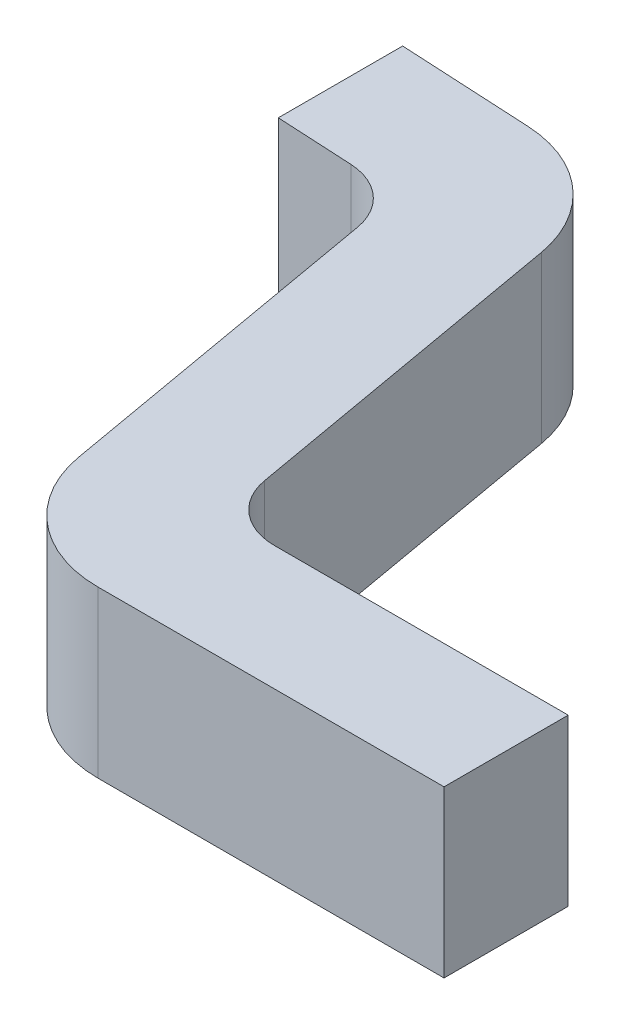
ISO-10303-21;
HEADER;
FILE_DESCRIPTION(('STEP AP214'),'2;1');
FILE_NAME('part.step','',(''),(''),'','','');
FILE_SCHEMA(('AUTOMOTIVE_DESIGN { 1 0 10303 214 1 1 1 1 }'));
ENDSEC;
DATA;
#1=APPLICATION_CONTEXT('core data for automotive mechanical design processes');
#2=APPLICATION_PROTOCOL_DEFINITION('international standard','automotive_design',2000,#1);
#3=PRODUCT_CONTEXT('',#1,'mechanical');
#4=PRODUCT('Part','Part','',(#3));
#5=PRODUCT_RELATED_PRODUCT_CATEGORY('part','',(#4));
#6=PRODUCT_DEFINITION_FORMATION('','',#4);
#7=PRODUCT_DEFINITION_CONTEXT('part definition',#1,'design');
#8=PRODUCT_DEFINITION('design','',#6,#7);
#9=PRODUCT_DEFINITION_SHAPE('','',#8);
#10=(LENGTH_UNIT() NAMED_UNIT(*) SI_UNIT(.MILLI.,.METRE.));
#11=(NAMED_UNIT(*) PLANE_ANGLE_UNIT() SI_UNIT($,.RADIAN.));
#12=(NAMED_UNIT(*) SI_UNIT($,.STERADIAN.) SOLID_ANGLE_UNIT());
#13=UNCERTAINTY_MEASURE_WITH_UNIT(LENGTH_MEASURE(1.E-05),#10,'distance_accuracy_value','');
#14=(GEOMETRIC_REPRESENTATION_CONTEXT(3) GLOBAL_UNCERTAINTY_ASSIGNED_CONTEXT((#13)) GLOBAL_UNIT_ASSIGNED_CONTEXT((#10,
#11,#12)) REPRESENTATION_CONTEXT('',''));
#15=CARTESIAN_POINT('',(0.,0.,0.));
#16=DIRECTION('',(0.,0.,1.));
#17=DIRECTION('',(1.,0.,0.));
#18=AXIS2_PLACEMENT_3D('',#15,#16,#17);
#19=CARTESIAN_POINT('',(35.054447896144,23.925497867435,0.43342975681));
#20=DIRECTION('',(8.74227743530297E-08,-0.999999999999996,0.));
#21=DIRECTION('',(0.999999999999996,8.74227743530297E-08,0.));
#22=AXIS2_PLACEMENT_3D('',#19,#20,#21);
#23=PLANE('',#22);
#24=DIRECTION('',(0.,0.,1.));
#25=VECTOR('',#24,1.);
#26=CARTESIAN_POINT('',(34.699999848699,23.925497836448,0.1502058519));
#27=LINE('',#26,#25);
#28=CARTESIAN_POINT('',(34.699999848699,23.9254978391413,0.150205851899956));
#29=VERTEX_POINT('',#28);
#30=CARTESIAN_POINT('',(34.6999998370743,23.925497836448,-6.092267662786E-10));
#31=VERTEX_POINT('',#30);
#32=EDGE_CURVE('E159',#29,#31,#27,.F.);
#33=ORIENTED_EDGE('',*,*,#32,.T.);
#34=DIRECTION('',(0.998629534754575,0.,0.0523359562429177));
#35=VECTOR('',#34,1.);
#36=CARTESIAN_POINT('',(34.699999848699,23.925497836448,0.));
#37=LINE('',#36,#35);
#38=CARTESIAN_POINT('',(34.8598479787902,23.9254978434356,0.00837728552066805));
#39=VERTEX_POINT('',#38);
#40=EDGE_CURVE('E151',#31,#39,#37,.T.);
#41=ORIENTED_EDGE('',*,*,#40,.T.);
#42=CARTESIAN_POINT('',(34.851997585354,23.9254978497368,0.158171715734));
#43=DIRECTION('',(8.74227743530297E-08,-0.999999999999996,0.));
#44=DIRECTION('',(0.999999999999996,8.74227743530297E-08,0.));
#45=AXIS2_PLACEMENT_3D('',#42,#43,#44);
#46=CIRCLE('',#45,0.15);
#47=CARTESIAN_POINT('',(34.9997187480424,23.925497862651,0.132124487588905));
#48=VERTEX_POINT('',#47);
#49=EDGE_CURVE('E195',#48,#39,#46,.F.);
#50=ORIENTED_EDGE('',*,*,#49,.F.);
#51=DIRECTION('',(0.173648177667034,0.,0.98480775301219));
#52=VECTOR('',#51,1.);
#53=CARTESIAN_POINT('',(34.978999848699,23.925497862651,0.01462177041997));
#54=LINE('',#53,#52);
#55=CARTESIAN_POINT('',(35.0712897153554,23.925497865779,0.538023613324977));
#56=VERTEX_POINT('',#55);
#57=EDGE_CURVE('E90',#48,#56,#54,.T.);
#58=ORIENTED_EDGE('',*,*,#57,.T.);
#59=CARTESIAN_POINT('',(35.145150296831,23.9254978753641,0.525));
#60=DIRECTION('',(8.74227743530297E-08,-0.999999999999996,0.));
#61=DIRECTION('',(0.999999999999996,8.74227743530297E-08,0.));
#62=AXIS2_PLACEMENT_3D('',#59,#60,#61);
#63=CIRCLE('',#62,0.075);
#64=CARTESIAN_POINT('',(35.145150279347,23.9254978753645,0.599999999999999));
#65=VERTEX_POINT('',#64);
#66=EDGE_CURVE('E20',#56,#65,#63,.F.);
#67=ORIENTED_EDGE('',*,*,#66,.T.);
#68=DIRECTION('',(1.,0.,0.));
#69=VECTOR('',#68,1.);
#70=CARTESIAN_POINT('',(35.082217824493,23.925497875365,0.6));
#71=LINE('',#70,#69);
#72=CARTESIAN_POINT('',(35.499999848699,23.9254978960457,0.6));
#73=VERTEX_POINT('',#72);
#74=EDGE_CURVE('E96',#65,#73,#71,.T.);
#75=ORIENTED_EDGE('',*,*,#74,.T.);
#76=DIRECTION('',(0.,0.,1.));
#77=VECTOR('',#76,1.);
#78=CARTESIAN_POINT('',(35.499999848699,23.925497906386,0.6));
#79=LINE('',#78,#77);
#80=CARTESIAN_POINT('',(35.4999998370423,23.925497906386,0.75));
#81=VERTEX_POINT('',#80);
#82=EDGE_CURVE('E101',#73,#81,#79,.T.);
#83=ORIENTED_EDGE('',*,*,#82,.T.);
#84=DIRECTION('',(-1.,0.,0.));
#85=VECTOR('',#84,1.);
#86=CARTESIAN_POINT('',(35.499999848699,23.925497906386,0.75));
#87=LINE('',#86,#85);
#88=CARTESIAN_POINT('',(35.082217824493,23.9254978881246,0.75));
#89=VERTEX_POINT('',#88);
#90=EDGE_CURVE('E119',#81,#89,#87,.T.);
#91=ORIENTED_EDGE('',*,*,#90,.T.);
#92=CARTESIAN_POINT('',(35.082217824493,23.9254978698632,0.6));
#93=DIRECTION('',(8.74227743530297E-08,-0.999999999999996,0.));
#94=DIRECTION('',(0.999999999999996,8.74227743530297E-08,0.));
#95=AXIS2_PLACEMENT_3D('',#92,#93,#94);
#96=CIRCLE('',#95,0.15);
#97=CARTESIAN_POINT('',(34.9344966612771,23.925497856949,0.62604722515503));
#98=VERTEX_POINT('',#97);
#99=EDGE_CURVE('E177',#98,#89,#96,.F.);
#100=ORIENTED_EDGE('',*,*,#99,.F.);
#101=DIRECTION('',(-0.173648177667034,0.,-0.98480775301219));
#102=VECTOR('',#101,1.);
#103=CARTESIAN_POINT('',(34.956352879816,23.925497856949,0.75));
#104=LINE('',#103,#102);
#105=CARTESIAN_POINT('',(34.862357035157,23.9254978537955,0.216923075066056));
#106=VERTEX_POINT('',#105);
#107=EDGE_CURVE('E172',#98,#106,#104,.T.);
#108=ORIENTED_EDGE('',*,*,#107,.T.);
#109=CARTESIAN_POINT('',(34.788496453681,23.9254978441849,0.229946688391));
#110=DIRECTION('',(8.74227743530297E-08,-0.999999999999996,0.));
#111=DIRECTION('',(0.999999999999996,8.74227743530297E-08,0.));
#112=AXIS2_PLACEMENT_3D('',#109,#110,#111);
#113=CIRCLE('',#112,0.075);
#114=CARTESIAN_POINT('',(34.7924216329629,23.925497844528,0.15504947237056));
#115=VERTEX_POINT('',#114);
#116=EDGE_CURVE('E169',#106,#115,#113,.F.);
#117=ORIENTED_EDGE('',*,*,#116,.T.);
#118=DIRECTION('',(-0.998629534754575,0.,-0.0523359562429177));
#119=VECTOR('',#118,1.);
#120=CARTESIAN_POINT('',(34.851997585354,23.925497844528,0.158171715734));
#121=LINE('',#120,#119);
#122=EDGE_CURVE('E165',#115,#29,#121,.T.);
#123=ORIENTED_EDGE('',*,*,#122,.T.);
#124=EDGE_LOOP('',(#33,#41,#50,#58,#67,#75,#83,#91,#100,#108,#117,#123));
#125=FACE_BOUND('',#124,.T.);
#126=ADVANCED_FACE('F17',(#125),#23,.T.);
#127=CARTESIAN_POINT('',(34.978999848699,23.925497860839,0.01462177041997));
#128=DIRECTION('',(-0.984807753012186,-8.60946259727163E-08,0.173648177667033));
#129=DIRECTION('',(0.173648177667034,0.,0.98480775301219));
#130=AXIS2_PLACEMENT_3D('',#127,#128,#129);
#131=PLANE('',#130);
#132=ORIENTED_EDGE('',*,*,#57,.F.);
#133=DIRECTION('',(8.74227743530297E-08,-0.999999999999996,0.));
#134=VECTOR('',#133,1.);
#135=CARTESIAN_POINT('',(34.9997187483058,23.9254978626502,0.132124489083952));
#136=LINE('',#135,#134);
#137=CARTESIAN_POINT('',(34.9997187308211,24.1254978626507,0.132124489083926));
#138=VERTEX_POINT('',#137);
#139=EDGE_CURVE('E154',#138,#48,#136,.T.);
#140=ORIENTED_EDGE('',*,*,#139,.F.);
#141=DIRECTION('',(0.173648177667817,1.51808053790604E-08,0.984807753012052));
#142=VECTOR('',#141,1.);
#143=CARTESIAN_POINT('',(34.999718730821,24.1254978626504,0.132124489084));
#144=LINE('',#143,#142);
#145=CARTESIAN_POINT('',(35.0712896978709,24.1254978689076,0.538023613325023));
#146=VERTEX_POINT('',#145);
#147=EDGE_CURVE('E194',#138,#146,#144,.T.);
#148=ORIENTED_EDGE('',*,*,#147,.T.);
#149=DIRECTION('',(8.74227743530297E-08,-0.999999999999996,0.));
#150=VECTOR('',#149,1.);
#151=CARTESIAN_POINT('',(35.0712897153551,23.9254978689079,0.538023613325082));
#152=LINE('',#151,#150);
#153=EDGE_CURVE('E148',#146,#56,#152,.T.);
#154=ORIENTED_EDGE('',*,*,#153,.T.);
#155=EDGE_LOOP('',(#132,#140,#148,#154));
#156=FACE_BOUND('',#155,.T.);
#157=ADVANCED_FACE('F255',(#156),#131,.F.);
#158=CARTESIAN_POINT('',(35.145150296831,23.925497875365,0.525));
#159=DIRECTION('',(8.74227743530297E-08,-0.999999999999996,0.));
#160=DIRECTION('',(0.999999999999996,8.74227743530297E-08,0.));
#161=AXIS2_PLACEMENT_3D('',#158,#159,#160);
#162=CYLINDRICAL_SURFACE('',#161,0.075);
#163=ORIENTED_EDGE('',*,*,#153,.F.);
#164=CARTESIAN_POINT('',(35.1451502793464,24.125497875365,0.525));
#165=DIRECTION('',(8.74227743530297E-08,-0.999999999999996,0.));
#166=DIRECTION('',(0.999999999999996,8.74227743530297E-08,0.));
#167=AXIS2_PLACEMENT_3D('',#164,#165,#166);
#168=CIRCLE('',#167,0.075);
#169=CARTESIAN_POINT('',(35.1451502793467,24.1254978753647,0.6));
#170=VERTEX_POINT('',#169);
#171=EDGE_CURVE('E135',#146,#170,#168,.F.);
#172=ORIENTED_EDGE('',*,*,#171,.T.);
#173=DIRECTION('',(0.,1.,0.));
#174=VECTOR('',#173,1.);
#175=CARTESIAN_POINT('',(35.145150279347,23.925497869863,0.6));
#176=LINE('',#175,#174);
#177=EDGE_CURVE('E143',#170,#65,#176,.F.);
#178=ORIENTED_EDGE('',*,*,#177,.T.);
#179=ORIENTED_EDGE('',*,*,#66,.F.);
#180=EDGE_LOOP('',(#163,#172,#178,#179));
#181=FACE_BOUND('',#180,.T.);
#182=ADVANCED_FACE('F258',(#181),#162,.F.);
#183=CARTESIAN_POINT('',(35.082217824493,23.925497869863,0.6));
#184=DIRECTION('',(0.,0.,1.));
#185=DIRECTION('',(1.,0.,0.));
#186=AXIS2_PLACEMENT_3D('',#183,#184,#185);
#187=PLANE('',#186);
#188=DIRECTION('',(0.999999999999996,8.74227743530297E-08,0.));
#189=VECTOR('',#188,1.);
#190=CARTESIAN_POINT('',(35.05444787866,24.125497867435,0.6));
#191=LINE('',#190,#189);
#192=CARTESIAN_POINT('',(35.4999998312141,24.1254979063864,0.6));
#193=VERTEX_POINT('',#192);
#194=EDGE_CURVE('E133',#170,#193,#191,.T.);
#195=ORIENTED_EDGE('',*,*,#194,.T.);
#196=DIRECTION('',(8.74227743530297E-08,-0.999999999999996,0.));
#197=VECTOR('',#196,1.);
#198=CARTESIAN_POINT('',(35.499999848699,23.925497906386,0.6));
#199=LINE('',#198,#197);
#200=EDGE_CURVE('E108',#193,#73,#199,.T.);
#201=ORIENTED_EDGE('',*,*,#200,.T.);
#202=ORIENTED_EDGE('',*,*,#74,.F.);
#203=ORIENTED_EDGE('',*,*,#177,.F.);
#204=EDGE_LOOP('',(#195,#201,#202,#203));
#205=FACE_BOUND('',#204,.T.);
#206=ADVANCED_FACE('F259',(#205),#187,.F.);
#207=CARTESIAN_POINT('',(35.499999848699,23.925497906386,0.6));
#208=DIRECTION('',(-0.999999999999996,-8.74227743530297E-08,0.));
#209=DIRECTION('',(8.74227743530297E-08,-0.999999999999996,0.));
#210=AXIS2_PLACEMENT_3D('',#207,#208,#209);
#211=PLANE('',#210);
#212=ORIENTED_EDGE('',*,*,#200,.F.);
#213=DIRECTION('',(0.,0.,1.));
#214=VECTOR('',#213,1.);
#215=CARTESIAN_POINT('',(35.499999831214,24.1254979063864,0.43342975681));
#216=LINE('',#215,#214);
#217=CARTESIAN_POINT('',(35.499999831214,24.1254979063864,0.75));
#218=VERTEX_POINT('',#217);
#219=EDGE_CURVE('E126',#193,#218,#216,.T.);
#220=ORIENTED_EDGE('',*,*,#219,.T.);
#221=DIRECTION('',(0.,1.,0.));
#222=VECTOR('',#221,1.);
#223=CARTESIAN_POINT('',(35.499999831214,23.925497906386,0.75));
#224=LINE('',#223,#222);
#225=EDGE_CURVE('E114',#218,#81,#224,.F.);
#226=ORIENTED_EDGE('',*,*,#225,.T.);
#227=ORIENTED_EDGE('',*,*,#82,.F.);
#228=EDGE_LOOP('',(#212,#220,#226,#227));
#229=FACE_BOUND('',#228,.T.);
#230=ADVANCED_FACE('F132',(#229),#211,.F.);
#231=CARTESIAN_POINT('',(35.499999848699,23.925497906386,0.75));
#232=DIRECTION('',(0.,0.,-1.));
#233=DIRECTION('',(-1.,0.,0.));
#234=AXIS2_PLACEMENT_3D('',#231,#232,#233);
#235=PLANE('',#234);
#236=ORIENTED_EDGE('',*,*,#90,.F.);
#237=ORIENTED_EDGE('',*,*,#225,.F.);
#238=DIRECTION('',(0.999999999999996,8.74227743530297E-08,0.));
#239=VECTOR('',#238,1.);
#240=CARTESIAN_POINT('',(35.05444787866,24.125497867435,0.75));
#241=LINE('',#240,#239);
#242=CARTESIAN_POINT('',(35.0822178070084,24.1254978698629,0.75));
#243=VERTEX_POINT('',#242);
#244=EDGE_CURVE('E118',#218,#243,#241,.F.);
#245=ORIENTED_EDGE('',*,*,#244,.T.);
#246=DIRECTION('',(8.74227743530297E-08,-0.999999999999996,0.));
#247=VECTOR('',#246,1.);
#248=CARTESIAN_POINT('',(35.082217824493,23.925497869863,0.75));
#249=LINE('',#248,#247);
#250=EDGE_CURVE('E198',#89,#243,#249,.F.);
#251=ORIENTED_EDGE('',*,*,#250,.F.);
#252=EDGE_LOOP('',(#236,#237,#245,#251));
#253=FACE_BOUND('',#252,.T.);
#254=ADVANCED_FACE('F116',(#253),#235,.F.);
#255=CARTESIAN_POINT('',(35.082217824493,23.925497869863,0.6));
#256=DIRECTION('',(8.74227743530297E-08,-0.999999999999996,0.));
#257=DIRECTION('',(0.999999999999996,8.74227743530297E-08,0.));
#258=AXIS2_PLACEMENT_3D('',#255,#256,#257);
#259=CYLINDRICAL_SURFACE('',#258,0.15);
#260=ORIENTED_EDGE('',*,*,#99,.T.);
#261=ORIENTED_EDGE('',*,*,#250,.T.);
#262=CARTESIAN_POINT('',(35.0822178070084,24.125497869863,0.6));
#263=DIRECTION('',(8.74227743530297E-08,-0.999999999999996,0.));
#264=DIRECTION('',(0.999999999999996,8.74227743530297E-08,0.));
#265=AXIS2_PLACEMENT_3D('',#262,#263,#264);
#266=CIRCLE('',#265,0.15);
#267=CARTESIAN_POINT('',(34.934496644056,24.1254978569487,0.626047226649938));
#268=VERTEX_POINT('',#267);
#269=EDGE_CURVE('E130',#243,#268,#266,.T.);
#270=ORIENTED_EDGE('',*,*,#269,.T.);
#271=DIRECTION('',(-8.47866551506157E-08,0.999999999999996,1.4950174907087E-08));
#272=VECTOR('',#271,1.);
#273=CARTESIAN_POINT('',(34.9344966610135,23.925497858859,0.626047223659932));
#274=LINE('',#273,#272);
#275=EDGE_CURVE('E175',#268,#98,#274,.F.);
#276=ORIENTED_EDGE('',*,*,#275,.T.);
#277=EDGE_LOOP('',(#260,#261,#270,#276));
#278=FACE_BOUND('',#277,.T.);
#279=ADVANCED_FACE('F289',(#278),#259,.T.);
#280=CARTESIAN_POINT('',(34.956352879816,23.925497858859,0.75));
#281=DIRECTION('',(0.984807753012186,8.60946259727163E-08,-0.173648177667033));
#282=DIRECTION('',(-0.173648177667034,0.,-0.98480775301219));
#283=AXIS2_PLACEMENT_3D('',#280,#281,#282);
#284=PLANE('',#283);
#285=ORIENTED_EDGE('',*,*,#107,.F.);
#286=ORIENTED_EDGE('',*,*,#275,.F.);
#287=DIRECTION('',(-0.173648177665251,-1.51808052080865E-08,-0.984807753012504));
#288=VECTOR('',#287,1.);
#289=CARTESIAN_POINT('',(34.934496644056,24.1254978569485,0.62604722665));
#290=LINE('',#289,#288);
#291=CARTESIAN_POINT('',(34.8623570176727,24.1254978506419,0.216923075066053));
#292=VERTEX_POINT('',#291);
#293=EDGE_CURVE('E190',#268,#292,#290,.T.);
#294=ORIENTED_EDGE('',*,*,#293,.T.);
#295=DIRECTION('',(8.74227743530297E-08,-0.999999999999996,0.));
#296=VECTOR('',#295,1.);
#297=CARTESIAN_POINT('',(34.8623570351569,23.9254978506421,0.216923075066109));
#298=LINE('',#297,#296);
#299=EDGE_CURVE('E174',#292,#106,#298,.T.);
#300=ORIENTED_EDGE('',*,*,#299,.T.);
#301=EDGE_LOOP('',(#285,#286,#294,#300));
#302=FACE_BOUND('',#301,.T.);
#303=ADVANCED_FACE('F285',(#302),#284,.F.);
#304=CARTESIAN_POINT('',(34.788496453681,23.925497844185,0.229946688391));
#305=DIRECTION('',(8.74227743530297E-08,-0.999999999999996,0.));
#306=DIRECTION('',(0.999999999999996,8.74227743530297E-08,0.));
#307=AXIS2_PLACEMENT_3D('',#304,#305,#306);
#308=CYLINDRICAL_SURFACE('',#307,0.075);
#309=ORIENTED_EDGE('',*,*,#299,.F.);
#310=CARTESIAN_POINT('',(34.7884964361964,24.1254978441848,0.229946688391));
#311=DIRECTION('',(8.74227743530297E-08,-0.999999999999996,0.));
#312=DIRECTION('',(0.999999999999996,8.74227743530297E-08,0.));
#313=AXIS2_PLACEMENT_3D('',#310,#311,#312);
#314=CIRCLE('',#313,0.075);
#315=CARTESIAN_POINT('',(34.7924216329146,24.125497844528,0.155049473284145));
#316=VERTEX_POINT('',#315);
#317=EDGE_CURVE('E186',#292,#316,#314,.F.);
#318=ORIENTED_EDGE('',*,*,#317,.T.);
#319=DIRECTION('',(-2.39455552550647E-10,1.,4.56908412885666E-09));
#320=VECTOR('',#319,1.);
#321=CARTESIAN_POINT('',(34.7924216329629,23.925497849736,0.155049472370511));
#322=LINE('',#321,#320);
#323=EDGE_CURVE('E168',#316,#115,#322,.F.);
#324=ORIENTED_EDGE('',*,*,#323,.T.);
#325=ORIENTED_EDGE('',*,*,#116,.F.);
#326=EDGE_LOOP('',(#309,#318,#324,#325));
#327=FACE_BOUND('',#326,.T.);
#328=ADVANCED_FACE('F282',(#327),#308,.F.);
#329=CARTESIAN_POINT('',(34.851997585354,23.925497849736,0.158171715734));
#330=DIRECTION('',(0.0523359562429177,4.57535449317505E-09,-0.998629534754575));
#331=DIRECTION('',(-0.998629534754575,0.,-0.0523359562429177));
#332=AXIS2_PLACEMENT_3D('',#329,#330,#331);
#333=PLANE('',#332);
#334=DIRECTION('',(-0.998629534754845,-8.73029555859384E-08,-0.0523359562376956));
#335=VECTOR('',#334,1.);
#336=CARTESIAN_POINT('',(34.792421632915,24.1254978445279,0.155049473284));
#337=LINE('',#336,#335);
#338=CARTESIAN_POINT('',(34.6999998312142,24.1254978364482,0.1502058519));
#339=VERTEX_POINT('',#338);
#340=EDGE_CURVE('E189',#316,#339,#337,.T.);
#341=ORIENTED_EDGE('',*,*,#340,.T.);
#342=DIRECTION('',(-8.74227743530297E-08,0.999999999999996,0.));
#343=VECTOR('',#342,1.);
#344=CARTESIAN_POINT('',(34.699999848699,23.925497836448,0.1502058519));
#345=LINE('',#344,#343);
#346=EDGE_CURVE('E162',#339,#29,#345,.F.);
#347=ORIENTED_EDGE('',*,*,#346,.T.);
#348=ORIENTED_EDGE('',*,*,#122,.F.);
#349=ORIENTED_EDGE('',*,*,#323,.F.);
#350=EDGE_LOOP('',(#341,#347,#348,#349));
#351=FACE_BOUND('',#350,.T.);
#352=ADVANCED_FACE('F250',(#351),#333,.F.);
#353=CARTESIAN_POINT('',(34.699999848699,23.925497836448,0.1502058519));
#354=DIRECTION('',(0.999999999999996,8.74227743530297E-08,0.));
#355=DIRECTION('',(-8.74227743530297E-08,0.999999999999996,0.));
#356=AXIS2_PLACEMENT_3D('',#353,#354,#355);
#357=PLANE('',#356);
#358=ORIENTED_EDGE('',*,*,#346,.F.);
#359=DIRECTION('',(0.,0.,1.));
#360=VECTOR('',#359,1.);
#361=CARTESIAN_POINT('',(34.699999831214,24.1254978364482,0.43342975681));
#362=LINE('',#361,#360);
#363=CARTESIAN_POINT('',(34.699999831214,24.1254978364482,0.));
#364=VERTEX_POINT('',#363);
#365=EDGE_CURVE('E214',#339,#364,#362,.F.);
#366=ORIENTED_EDGE('',*,*,#365,.T.);
#367=DIRECTION('',(-2.39455552550647E-10,1.,4.56908412885666E-09));
#368=VECTOR('',#367,1.);
#369=CARTESIAN_POINT('',(34.6999998312619,23.925497836448,-9.13840165484259E-10));
#370=LINE('',#369,#368);
#371=EDGE_CURVE('E155',#364,#31,#370,.F.);
#372=ORIENTED_EDGE('',*,*,#371,.T.);
#373=ORIENTED_EDGE('',*,*,#32,.F.);
#374=EDGE_LOOP('',(#358,#366,#372,#373));
#375=FACE_BOUND('',#374,.T.);
#376=ADVANCED_FACE('F246',(#375),#357,.F.);
#377=CARTESIAN_POINT('',(34.699999848699,23.925497836448,0.));
#378=DIRECTION('',(-0.0523359562429177,-4.57535449317505E-09,0.998629534754575));
#379=DIRECTION('',(0.998629534754575,0.,0.0523359562429177));
#380=AXIS2_PLACEMENT_3D('',#377,#378,#379);
#381=PLANE('',#380);
#382=ORIENTED_EDGE('',*,*,#40,.F.);
#383=ORIENTED_EDGE('',*,*,#371,.F.);
#384=DIRECTION('',(0.998629534754576,8.73029631973461E-08,0.0523359562428303));
#385=VECTOR('',#384,1.);
#386=CARTESIAN_POINT('',(34.699999831214,24.1254978364482,0.));
#387=LINE('',#386,#385);
#388=CARTESIAN_POINT('',(34.8598479613057,24.1254978504228,0.0083772855206746));
#389=VERTEX_POINT('',#388);
#390=EDGE_CURVE('E26',#364,#389,#387,.T.);
#391=ORIENTED_EDGE('',*,*,#390,.T.);
#392=DIRECTION('',(8.74227743530297E-08,-0.999999999999996,0.));
#393=VECTOR('',#392,1.);
#394=CARTESIAN_POINT('',(34.85984797879,23.9254978504223,0.00837728552079053));
#395=LINE('',#394,#393);
#396=EDGE_CURVE('E34',#39,#389,#395,.F.);
#397=ORIENTED_EDGE('',*,*,#396,.F.);
#398=EDGE_LOOP('',(#382,#383,#391,#397));
#399=FACE_BOUND('',#398,.T.);
#400=ADVANCED_FACE('F241',(#399),#381,.F.);
#401=CARTESIAN_POINT('',(34.851997585354,23.925497849736,0.158171715734));
#402=DIRECTION('',(8.74227743530297E-08,-0.999999999999996,0.));
#403=DIRECTION('',(0.999999999999996,8.74227743530297E-08,0.));
#404=AXIS2_PLACEMENT_3D('',#401,#402,#403);
#405=CYLINDRICAL_SURFACE('',#404,0.15);
#406=ORIENTED_EDGE('',*,*,#49,.T.);
#407=ORIENTED_EDGE('',*,*,#396,.T.);
#408=CARTESIAN_POINT('',(34.8519975678694,24.1254978497367,0.158171715734));
#409=DIRECTION('',(8.74227743530297E-08,-0.999999999999996,0.));
#410=DIRECTION('',(0.999999999999996,8.74227743530297E-08,0.));
#411=AXIS2_PLACEMENT_3D('',#408,#409,#410);
#412=CIRCLE('',#411,0.15);
#413=EDGE_CURVE('E11',#389,#138,#412,.T.);
#414=ORIENTED_EDGE('',*,*,#413,.T.);
#415=ORIENTED_EDGE('',*,*,#139,.T.);
#416=EDGE_LOOP('',(#406,#407,#414,#415));
#417=FACE_BOUND('',#416,.T.);
#418=ADVANCED_FACE('F252',(#417),#405,.T.);
#419=CARTESIAN_POINT('',(35.05444787866,24.125497867435,0.43342975681));
#420=DIRECTION('',(8.74227743530297E-08,-0.999999999999996,0.));
#421=DIRECTION('',(0.999999999999996,8.74227743530297E-08,0.));
#422=AXIS2_PLACEMENT_3D('',#419,#420,#421);
#423=PLANE('',#422);
#424=ORIENTED_EDGE('',*,*,#390,.F.);
#425=ORIENTED_EDGE('',*,*,#365,.F.);
#426=ORIENTED_EDGE('',*,*,#340,.F.);
#427=ORIENTED_EDGE('',*,*,#317,.F.);
#428=ORIENTED_EDGE('',*,*,#293,.F.);
#429=ORIENTED_EDGE('',*,*,#269,.F.);
#430=ORIENTED_EDGE('',*,*,#244,.F.);
#431=ORIENTED_EDGE('',*,*,#219,.F.);
#432=ORIENTED_EDGE('',*,*,#194,.F.);
#433=ORIENTED_EDGE('',*,*,#171,.F.);
#434=ORIENTED_EDGE('',*,*,#147,.F.);
#435=ORIENTED_EDGE('',*,*,#413,.F.);
#436=EDGE_LOOP('',(#424,#425,#426,#427,#428,#429,#430,#431,#432,#433,#434,#435));
#437=FACE_BOUND('',#436,.T.);
#438=ADVANCED_FACE('F124',(#437),#423,.F.);
#439=CLOSED_SHELL('',(#126,#157,#182,#206,#230,#254,#279,#303,#328,#352,#376,#400,#418,#438));
#440=MANIFOLD_SOLID_BREP('B1',#439);
#441=ADVANCED_BREP_SHAPE_REPRESENTATION('',(#18,#440),#14);
#442=SHAPE_DEFINITION_REPRESENTATION(#9,#441);
ENDSEC;
END-ISO-10303-21;
